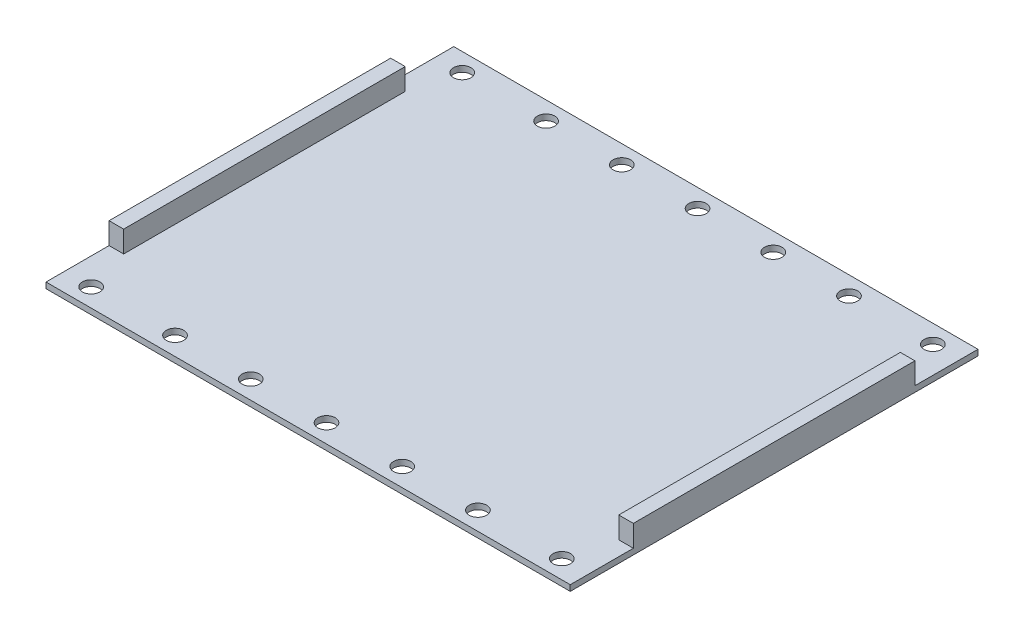
ISO-10303-21;
HEADER;
FILE_DESCRIPTION(('STEP AP214'),'2;1');
FILE_NAME('part.step','',(''),(''),'','','');
FILE_SCHEMA(('AUTOMOTIVE_DESIGN { 1 0 10303 214 1 1 1 1 }'));
ENDSEC;
DATA;
#1=APPLICATION_CONTEXT('core data for automotive mechanical design processes');
#2=APPLICATION_PROTOCOL_DEFINITION('international standard','automotive_design',2000,#1);
#3=PRODUCT_CONTEXT('',#1,'mechanical');
#4=PRODUCT('Part','Part','',(#3));
#5=PRODUCT_RELATED_PRODUCT_CATEGORY('part','',(#4));
#6=PRODUCT_DEFINITION_FORMATION('','',#4);
#7=PRODUCT_DEFINITION_CONTEXT('part definition',#1,'design');
#8=PRODUCT_DEFINITION('design','',#6,#7);
#9=PRODUCT_DEFINITION_SHAPE('','',#8);
#10=(LENGTH_UNIT() NAMED_UNIT(*) SI_UNIT(.MILLI.,.METRE.));
#11=(NAMED_UNIT(*) PLANE_ANGLE_UNIT() SI_UNIT($,.RADIAN.));
#12=(NAMED_UNIT(*) SI_UNIT($,.STERADIAN.) SOLID_ANGLE_UNIT());
#13=UNCERTAINTY_MEASURE_WITH_UNIT(LENGTH_MEASURE(1.E-05),#10,'distance_accuracy_value','');
#14=(GEOMETRIC_REPRESENTATION_CONTEXT(3) GLOBAL_UNCERTAINTY_ASSIGNED_CONTEXT((#13)) GLOBAL_UNIT_ASSIGNED_CONTEXT((#10,
#11,#12)) REPRESENTATION_CONTEXT('',''));
#15=CARTESIAN_POINT('',(0.,0.,0.));
#16=DIRECTION('',(0.,0.,1.));
#17=DIRECTION('',(1.,0.,0.));
#18=AXIS2_PLACEMENT_3D('',#15,#16,#17);
#19=CARTESIAN_POINT('',(0.,1.,0.));
#20=DIRECTION('',(0.,1.,0.));
#21=DIRECTION('',(0.,0.,1.));
#22=AXIS2_PLACEMENT_3D('',#19,#20,#21);
#23=PLANE('',#22);
#24=CARTESIAN_POINT('',(-13.,0.999999999999999,-31.85));
#25=DIRECTION('',(0.,1.,0.));
#26=DIRECTION('',(0.,0.,1.));
#27=AXIS2_PLACEMENT_3D('',#24,#25,#26);
#28=CIRCLE('',#27,1.5);
#29=CARTESIAN_POINT('',(-13.,0.999999999999999,-30.35));
#30=VERTEX_POINT('',#29);
#31=EDGE_CURVE('E414',#30,#30,#28,.F.);
#32=ORIENTED_EDGE('',*,*,#31,.T.);
#33=EDGE_LOOP('',(#32));
#34=FACE_BOUND('',#33,.T.);
#35=CARTESIAN_POINT('',(26.,0.999999999999999,-31.85));
#36=DIRECTION('',(0.,1.,0.));
#37=DIRECTION('',(0.,0.,1.));
#38=AXIS2_PLACEMENT_3D('',#35,#36,#37);
#39=CIRCLE('',#38,1.5);
#40=CARTESIAN_POINT('',(26.,0.999999999999999,-30.35));
#41=VERTEX_POINT('',#40);
#42=EDGE_CURVE('E411',#41,#41,#39,.F.);
#43=ORIENTED_EDGE('',*,*,#42,.T.);
#44=EDGE_LOOP('',(#43));
#45=FACE_BOUND('',#44,.T.);
#46=CARTESIAN_POINT('',(-26.,0.999999999999999,-31.85));
#47=DIRECTION('',(0.,1.,0.));
#48=DIRECTION('',(0.,0.,1.));
#49=AXIS2_PLACEMENT_3D('',#46,#47,#48);
#50=CIRCLE('',#49,1.5);
#51=CARTESIAN_POINT('',(-26.,0.999999999999999,-30.35));
#52=VERTEX_POINT('',#51);
#53=EDGE_CURVE('E391',#52,#52,#50,.F.);
#54=ORIENTED_EDGE('',*,*,#53,.T.);
#55=EDGE_LOOP('',(#54));
#56=FACE_BOUND('',#55,.T.);
#57=CARTESIAN_POINT('',(13.,0.999999999999999,-31.85));
#58=DIRECTION('',(0.,1.,0.));
#59=DIRECTION('',(0.,0.,1.));
#60=AXIS2_PLACEMENT_3D('',#57,#58,#59);
#61=CIRCLE('',#60,1.5);
#62=CARTESIAN_POINT('',(13.,0.999999999999999,-30.35));
#63=VERTEX_POINT('',#62);
#64=EDGE_CURVE('E407',#63,#63,#61,.F.);
#65=ORIENTED_EDGE('',*,*,#64,.T.);
#66=EDGE_LOOP('',(#65));
#67=FACE_BOUND('',#66,.T.);
#68=CARTESIAN_POINT('',(0.,0.999999999999999,-31.85));
#69=DIRECTION('',(0.,1.,0.));
#70=DIRECTION('',(0.,0.,1.));
#71=AXIS2_PLACEMENT_3D('',#68,#69,#70);
#72=CIRCLE('',#71,1.5);
#73=CARTESIAN_POINT('',(0.,0.999999999999999,-30.35));
#74=VERTEX_POINT('',#73);
#75=EDGE_CURVE('E419',#74,#74,#72,.F.);
#76=ORIENTED_EDGE('',*,*,#75,.T.);
#77=EDGE_LOOP('',(#76));
#78=FACE_BOUND('',#77,.T.);
#79=CARTESIAN_POINT('',(-26.,0.999999999999999,31.85));
#80=DIRECTION('',(0.,1.,0.));
#81=DIRECTION('',(0.,0.,1.));
#82=AXIS2_PLACEMENT_3D('',#79,#80,#81);
#83=CIRCLE('',#82,1.5);
#84=CARTESIAN_POINT('',(-26.,0.999999999999999,33.35));
#85=VERTEX_POINT('',#84);
#86=EDGE_CURVE('E429',#85,#85,#83,.T.);
#87=ORIENTED_EDGE('',*,*,#86,.F.);
#88=EDGE_LOOP('',(#87));
#89=FACE_BOUND('',#88,.T.);
#90=CARTESIAN_POINT('',(13.,0.999999999999999,31.85));
#91=DIRECTION('',(0.,1.,0.));
#92=DIRECTION('',(0.,0.,1.));
#93=AXIS2_PLACEMENT_3D('',#90,#91,#92);
#94=CIRCLE('',#93,1.5);
#95=CARTESIAN_POINT('',(13.,0.999999999999999,33.35));
#96=VERTEX_POINT('',#95);
#97=EDGE_CURVE('E428',#96,#96,#94,.T.);
#98=ORIENTED_EDGE('',*,*,#97,.F.);
#99=EDGE_LOOP('',(#98));
#100=FACE_BOUND('',#99,.T.);
#101=CARTESIAN_POINT('',(26.,0.999999999999999,31.85));
#102=DIRECTION('',(0.,1.,0.));
#103=DIRECTION('',(0.,0.,1.));
#104=AXIS2_PLACEMENT_3D('',#101,#102,#103);
#105=CIRCLE('',#104,1.5);
#106=CARTESIAN_POINT('',(26.,0.999999999999999,33.35));
#107=VERTEX_POINT('',#106);
#108=EDGE_CURVE('E422',#107,#107,#105,.T.);
#109=ORIENTED_EDGE('',*,*,#108,.F.);
#110=EDGE_LOOP('',(#109));
#111=FACE_BOUND('',#110,.T.);
#112=CARTESIAN_POINT('',(-13.,0.999999999999999,31.85));
#113=DIRECTION('',(0.,1.,0.));
#114=DIRECTION('',(0.,0.,1.));
#115=AXIS2_PLACEMENT_3D('',#112,#113,#114);
#116=CIRCLE('',#115,1.5);
#117=CARTESIAN_POINT('',(-13.,0.999999999999999,33.35));
#118=VERTEX_POINT('',#117);
#119=EDGE_CURVE('E436',#118,#118,#116,.T.);
#120=ORIENTED_EDGE('',*,*,#119,.F.);
#121=EDGE_LOOP('',(#120));
#122=FACE_BOUND('',#121,.T.);
#123=CARTESIAN_POINT('',(0.,0.999999999999999,31.85));
#124=DIRECTION('',(0.,1.,0.));
#125=DIRECTION('',(0.,0.,1.));
#126=AXIS2_PLACEMENT_3D('',#123,#124,#125);
#127=CIRCLE('',#126,1.5);
#128=CARTESIAN_POINT('',(0.,0.999999999999999,33.35));
#129=VERTEX_POINT('',#128);
#130=EDGE_CURVE('E157',#129,#129,#127,.T.);
#131=ORIENTED_EDGE('',*,*,#130,.F.);
#132=EDGE_LOOP('',(#131));
#133=FACE_BOUND('',#132,.T.);
#134=DIRECTION('',(-1.,0.,0.));
#135=VECTOR('',#134,1.);
#136=CARTESIAN_POINT('',(-42.5,1.,24.1700000000001));
#137=LINE('',#136,#135);
#138=CARTESIAN_POINT('',(-42.5,1.,24.1700000000001));
#139=VERTEX_POINT('',#138);
#140=CARTESIAN_POINT('',(-45.,1.,24.1700000000001));
#141=VERTEX_POINT('',#140);
#142=EDGE_CURVE('E155',#139,#141,#137,.T.);
#143=ORIENTED_EDGE('',*,*,#142,.T.);
#144=DIRECTION('',(0.,0.,1.));
#145=VECTOR('',#144,1.);
#146=CARTESIAN_POINT('',(-45.,1.,-35.));
#147=LINE('',#146,#145);
#148=CARTESIAN_POINT('',(-45.,1.,35.));
#149=VERTEX_POINT('',#148);
#150=EDGE_CURVE('E131',#141,#149,#147,.T.);
#151=ORIENTED_EDGE('',*,*,#150,.T.);
#152=DIRECTION('',(1.,0.,0.));
#153=VECTOR('',#152,1.);
#154=CARTESIAN_POINT('',(-45.,1.,35.));
#155=LINE('',#154,#153);
#156=CARTESIAN_POINT('',(45.,1.,35.));
#157=VERTEX_POINT('',#156);
#158=EDGE_CURVE('E225',#149,#157,#155,.T.);
#159=ORIENTED_EDGE('',*,*,#158,.T.);
#160=DIRECTION('',(0.,0.,-1.));
#161=VECTOR('',#160,1.);
#162=CARTESIAN_POINT('',(45.,1.,-35.));
#163=LINE('',#162,#161);
#164=CARTESIAN_POINT('',(45.,1.,24.1700000000001));
#165=VERTEX_POINT('',#164);
#166=EDGE_CURVE('E218',#157,#165,#163,.T.);
#167=ORIENTED_EDGE('',*,*,#166,.T.);
#168=DIRECTION('',(1.,0.,0.));
#169=VECTOR('',#168,1.);
#170=CARTESIAN_POINT('',(42.5,1.,24.1700000000001));
#171=LINE('',#170,#169);
#172=CARTESIAN_POINT('',(42.5,1.,24.1700000000001));
#173=VERTEX_POINT('',#172);
#174=EDGE_CURVE('E168',#173,#165,#171,.T.);
#175=ORIENTED_EDGE('',*,*,#174,.F.);
#176=DIRECTION('',(0.,0.,1.));
#177=VECTOR('',#176,1.);
#178=CARTESIAN_POINT('',(42.5,1.,24.1700000000001));
#179=LINE('',#178,#177);
#180=CARTESIAN_POINT('',(42.5,1.,-24.1699999999999));
#181=VERTEX_POINT('',#180);
#182=EDGE_CURVE('E177',#181,#173,#179,.T.);
#183=ORIENTED_EDGE('',*,*,#182,.F.);
#184=DIRECTION('',(-1.,0.,0.));
#185=VECTOR('',#184,1.);
#186=CARTESIAN_POINT('',(42.5,1.,-24.1699999999999));
#187=LINE('',#186,#185);
#188=CARTESIAN_POINT('',(45.,1.,-24.1699999999999));
#189=VERTEX_POINT('',#188);
#190=EDGE_CURVE('E135',#189,#181,#187,.T.);
#191=ORIENTED_EDGE('',*,*,#190,.F.);
#192=CARTESIAN_POINT('',(45.,1.,-35.));
#193=VERTEX_POINT('',#192);
#194=EDGE_CURVE('E221',#189,#193,#163,.T.);
#195=ORIENTED_EDGE('',*,*,#194,.T.);
#196=DIRECTION('',(-1.,0.,0.));
#197=VECTOR('',#196,1.);
#198=CARTESIAN_POINT('',(-45.,1.,-35.));
#199=LINE('',#198,#197);
#200=CARTESIAN_POINT('',(-45.,1.,-35.));
#201=VERTEX_POINT('',#200);
#202=EDGE_CURVE('E220',#193,#201,#199,.T.);
#203=ORIENTED_EDGE('',*,*,#202,.T.);
#204=CARTESIAN_POINT('',(-45.,1.,-24.1699999999999));
#205=VERTEX_POINT('',#204);
#206=EDGE_CURVE('E223',#201,#205,#147,.T.);
#207=ORIENTED_EDGE('',*,*,#206,.T.);
#208=DIRECTION('',(1.,0.,0.));
#209=VECTOR('',#208,1.);
#210=CARTESIAN_POINT('',(-42.5,1.,-24.1699999999999));
#211=LINE('',#210,#209);
#212=CARTESIAN_POINT('',(-42.5,1.,-24.1699999999999));
#213=VERTEX_POINT('',#212);
#214=EDGE_CURVE('E55',#205,#213,#211,.T.);
#215=ORIENTED_EDGE('',*,*,#214,.T.);
#216=DIRECTION('',(0.,0.,1.));
#217=VECTOR('',#216,1.);
#218=CARTESIAN_POINT('',(-42.5,1.,24.1700000000001));
#219=LINE('',#218,#217);
#220=EDGE_CURVE('E50',#213,#139,#219,.T.);
#221=ORIENTED_EDGE('',*,*,#220,.T.);
#222=EDGE_LOOP('',(#143,#151,#159,#167,#175,#183,#191,#195,#203,#207,#215,#221));
#223=FACE_BOUND('',#222,.T.);
#224=CARTESIAN_POINT('',(40.4,1.,-31.85));
#225=DIRECTION('',(0.,1.,0.));
#226=DIRECTION('',(0.,0.,-1.));
#227=AXIS2_PLACEMENT_3D('',#224,#225,#226);
#228=CIRCLE('',#227,1.5);
#229=CARTESIAN_POINT('',(40.4,1.,-33.35));
#230=VERTEX_POINT('',#229);
#231=EDGE_CURVE('E200',#230,#230,#228,.T.);
#232=ORIENTED_EDGE('',*,*,#231,.F.);
#233=EDGE_LOOP('',(#232));
#234=FACE_BOUND('',#233,.T.);
#235=CARTESIAN_POINT('',(40.4,1.,31.85));
#236=DIRECTION('',(0.,1.,0.));
#237=DIRECTION('',(0.,0.,1.));
#238=AXIS2_PLACEMENT_3D('',#235,#236,#237);
#239=CIRCLE('',#238,1.5);
#240=CARTESIAN_POINT('',(40.4,1.,33.35));
#241=VERTEX_POINT('',#240);
#242=EDGE_CURVE('E212',#241,#241,#239,.T.);
#243=ORIENTED_EDGE('',*,*,#242,.F.);
#244=EDGE_LOOP('',(#243));
#245=FACE_BOUND('',#244,.T.);
#246=CARTESIAN_POINT('',(-40.4,1.,31.85));
#247=DIRECTION('',(0.,1.,0.));
#248=DIRECTION('',(0.,0.,-1.));
#249=AXIS2_PLACEMENT_3D('',#246,#247,#248);
#250=CIRCLE('',#249,1.5);
#251=CARTESIAN_POINT('',(-40.4,1.,30.35));
#252=VERTEX_POINT('',#251);
#253=EDGE_CURVE('E206',#252,#252,#250,.T.);
#254=ORIENTED_EDGE('',*,*,#253,.F.);
#255=EDGE_LOOP('',(#254));
#256=FACE_BOUND('',#255,.T.);
#257=CARTESIAN_POINT('',(-40.4,1.,-31.85));
#258=DIRECTION('',(0.,1.,0.));
#259=DIRECTION('',(0.,0.,1.));
#260=AXIS2_PLACEMENT_3D('',#257,#258,#259);
#261=CIRCLE('',#260,1.5);
#262=CARTESIAN_POINT('',(-40.4,1.,-30.35));
#263=VERTEX_POINT('',#262);
#264=EDGE_CURVE('E194',#263,#263,#261,.T.);
#265=ORIENTED_EDGE('',*,*,#264,.F.);
#266=EDGE_LOOP('',(#265));
#267=FACE_BOUND('',#266,.T.);
#268=ADVANCED_FACE('F35',(#34,#45,#56,#67,#78,#89,#100,#111,#122,#133,#223,#234,#245,#256,#267),
#23,.T.);
#269=CARTESIAN_POINT('',(0.,0.,0.));
#270=DIRECTION('',(0.,1.,0.));
#271=DIRECTION('',(0.,0.,1.));
#272=AXIS2_PLACEMENT_3D('',#269,#270,#271);
#273=PLANE('',#272);
#274=CARTESIAN_POINT('',(-13.,0.,-31.85));
#275=DIRECTION('',(0.,1.,0.));
#276=DIRECTION('',(0.,0.,1.));
#277=AXIS2_PLACEMENT_3D('',#274,#275,#276);
#278=CIRCLE('',#277,1.5);
#279=CARTESIAN_POINT('',(-13.,0.,-30.35));
#280=VERTEX_POINT('',#279);
#281=EDGE_CURVE('E396',#280,#280,#278,.T.);
#282=ORIENTED_EDGE('',*,*,#281,.T.);
#283=EDGE_LOOP('',(#282));
#284=FACE_BOUND('',#283,.T.);
#285=CARTESIAN_POINT('',(26.,0.,-31.85));
#286=DIRECTION('',(0.,1.,0.));
#287=DIRECTION('',(0.,0.,1.));
#288=AXIS2_PLACEMENT_3D('',#285,#286,#287);
#289=CIRCLE('',#288,1.5);
#290=CARTESIAN_POINT('',(26.,0.,-30.35));
#291=VERTEX_POINT('',#290);
#292=EDGE_CURVE('E399',#291,#291,#289,.T.);
#293=ORIENTED_EDGE('',*,*,#292,.T.);
#294=EDGE_LOOP('',(#293));
#295=FACE_BOUND('',#294,.T.);
#296=CARTESIAN_POINT('',(-26.,0.,-31.85));
#297=DIRECTION('',(0.,1.,0.));
#298=DIRECTION('',(0.,0.,1.));
#299=AXIS2_PLACEMENT_3D('',#296,#297,#298);
#300=CIRCLE('',#299,1.5);
#301=CARTESIAN_POINT('',(-26.,0.,-30.35));
#302=VERTEX_POINT('',#301);
#303=EDGE_CURVE('E394',#302,#302,#300,.T.);
#304=ORIENTED_EDGE('',*,*,#303,.T.);
#305=EDGE_LOOP('',(#304));
#306=FACE_BOUND('',#305,.T.);
#307=CARTESIAN_POINT('',(13.,0.,-31.85));
#308=DIRECTION('',(0.,1.,0.));
#309=DIRECTION('',(0.,0.,1.));
#310=AXIS2_PLACEMENT_3D('',#307,#308,#309);
#311=CIRCLE('',#310,1.5);
#312=CARTESIAN_POINT('',(13.,0.,-30.35));
#313=VERTEX_POINT('',#312);
#314=EDGE_CURVE('E403',#313,#313,#311,.T.);
#315=ORIENTED_EDGE('',*,*,#314,.T.);
#316=EDGE_LOOP('',(#315));
#317=FACE_BOUND('',#316,.T.);
#318=CARTESIAN_POINT('',(0.,0.,-31.85));
#319=DIRECTION('',(0.,1.,0.));
#320=DIRECTION('',(0.,0.,1.));
#321=AXIS2_PLACEMENT_3D('',#318,#319,#320);
#322=CIRCLE('',#321,1.5);
#323=CARTESIAN_POINT('',(0.,0.,-30.35));
#324=VERTEX_POINT('',#323);
#325=EDGE_CURVE('E416',#324,#324,#322,.T.);
#326=ORIENTED_EDGE('',*,*,#325,.T.);
#327=EDGE_LOOP('',(#326));
#328=FACE_BOUND('',#327,.T.);
#329=CARTESIAN_POINT('',(-26.,0.,31.85));
#330=DIRECTION('',(0.,-1.,0.));
#331=DIRECTION('',(0.,0.,-1.));
#332=AXIS2_PLACEMENT_3D('',#329,#330,#331);
#333=CIRCLE('',#332,1.5);
#334=CARTESIAN_POINT('',(-26.,0.,30.35));
#335=VERTEX_POINT('',#334);
#336=EDGE_CURVE('E432',#335,#335,#333,.T.);
#337=ORIENTED_EDGE('',*,*,#336,.F.);
#338=EDGE_LOOP('',(#337));
#339=FACE_BOUND('',#338,.T.);
#340=CARTESIAN_POINT('',(13.,0.,31.85));
#341=DIRECTION('',(0.,-1.,0.));
#342=DIRECTION('',(0.,0.,-1.));
#343=AXIS2_PLACEMENT_3D('',#340,#341,#342);
#344=CIRCLE('',#343,1.5);
#345=CARTESIAN_POINT('',(13.,0.,30.35));
#346=VERTEX_POINT('',#345);
#347=EDGE_CURVE('E433',#346,#346,#344,.T.);
#348=ORIENTED_EDGE('',*,*,#347,.F.);
#349=EDGE_LOOP('',(#348));
#350=FACE_BOUND('',#349,.T.);
#351=CARTESIAN_POINT('',(26.,0.,31.85));
#352=DIRECTION('',(0.,-1.,0.));
#353=DIRECTION('',(0.,0.,-1.));
#354=AXIS2_PLACEMENT_3D('',#351,#352,#353);
#355=CIRCLE('',#354,1.5);
#356=CARTESIAN_POINT('',(26.,0.,30.35));
#357=VERTEX_POINT('',#356);
#358=EDGE_CURVE('E425',#357,#357,#355,.T.);
#359=ORIENTED_EDGE('',*,*,#358,.F.);
#360=EDGE_LOOP('',(#359));
#361=FACE_BOUND('',#360,.T.);
#362=CARTESIAN_POINT('',(-13.,0.,31.85));
#363=DIRECTION('',(0.,-1.,0.));
#364=DIRECTION('',(0.,0.,-1.));
#365=AXIS2_PLACEMENT_3D('',#362,#363,#364);
#366=CIRCLE('',#365,1.5);
#367=CARTESIAN_POINT('',(-13.,0.,30.35));
#368=VERTEX_POINT('',#367);
#369=EDGE_CURVE('E443',#368,#368,#366,.T.);
#370=ORIENTED_EDGE('',*,*,#369,.F.);
#371=EDGE_LOOP('',(#370));
#372=FACE_BOUND('',#371,.T.);
#373=CARTESIAN_POINT('',(0.,0.,31.85));
#374=DIRECTION('',(0.,-1.,0.));
#375=DIRECTION('',(0.,0.,-1.));
#376=AXIS2_PLACEMENT_3D('',#373,#374,#375);
#377=CIRCLE('',#376,1.5);
#378=CARTESIAN_POINT('',(0.,0.,30.35));
#379=VERTEX_POINT('',#378);
#380=EDGE_CURVE('E446',#379,#379,#377,.T.);
#381=ORIENTED_EDGE('',*,*,#380,.F.);
#382=EDGE_LOOP('',(#381));
#383=FACE_BOUND('',#382,.T.);
#384=DIRECTION('',(0.,0.,-1.));
#385=VECTOR('',#384,1.);
#386=CARTESIAN_POINT('',(45.,0.,-35.));
#387=LINE('',#386,#385);
#388=CARTESIAN_POINT('',(45.,0.,35.));
#389=VERTEX_POINT('',#388);
#390=CARTESIAN_POINT('',(45.,0.,-35.));
#391=VERTEX_POINT('',#390);
#392=EDGE_CURVE('E215',#389,#391,#387,.T.);
#393=ORIENTED_EDGE('',*,*,#392,.F.);
#394=DIRECTION('',(1.,0.,0.));
#395=VECTOR('',#394,1.);
#396=CARTESIAN_POINT('',(-45.,0.,35.));
#397=LINE('',#396,#395);
#398=CARTESIAN_POINT('',(-45.,0.,35.));
#399=VERTEX_POINT('',#398);
#400=EDGE_CURVE('E234',#399,#389,#397,.T.);
#401=ORIENTED_EDGE('',*,*,#400,.F.);
#402=DIRECTION('',(0.,0.,1.));
#403=VECTOR('',#402,1.);
#404=CARTESIAN_POINT('',(-45.,0.,-35.));
#405=LINE('',#404,#403);
#406=CARTESIAN_POINT('',(-45.,0.,-35.));
#407=VERTEX_POINT('',#406);
#408=EDGE_CURVE('E232',#407,#399,#405,.T.);
#409=ORIENTED_EDGE('',*,*,#408,.F.);
#410=DIRECTION('',(-1.,0.,0.));
#411=VECTOR('',#410,1.);
#412=CARTESIAN_POINT('',(-45.,0.,-35.));
#413=LINE('',#412,#411);
#414=EDGE_CURVE('E230',#391,#407,#413,.T.);
#415=ORIENTED_EDGE('',*,*,#414,.F.);
#416=EDGE_LOOP('',(#393,#401,#409,#415));
#417=FACE_BOUND('',#416,.T.);
#418=CARTESIAN_POINT('',(40.4,0.,31.85));
#419=DIRECTION('',(0.,1.,0.));
#420=DIRECTION('',(0.,0.,1.));
#421=AXIS2_PLACEMENT_3D('',#418,#419,#420);
#422=CIRCLE('',#421,1.5);
#423=CARTESIAN_POINT('',(40.4,0.,33.35));
#424=VERTEX_POINT('',#423);
#425=EDGE_CURVE('E209',#424,#424,#422,.T.);
#426=ORIENTED_EDGE('',*,*,#425,.T.);
#427=EDGE_LOOP('',(#426));
#428=FACE_BOUND('',#427,.T.);
#429=CARTESIAN_POINT('',(-40.4,0.,31.85));
#430=DIRECTION('',(0.,1.,0.));
#431=DIRECTION('',(0.,0.,-1.));
#432=AXIS2_PLACEMENT_3D('',#429,#430,#431);
#433=CIRCLE('',#432,1.5);
#434=CARTESIAN_POINT('',(-40.4,0.,30.35));
#435=VERTEX_POINT('',#434);
#436=EDGE_CURVE('E203',#435,#435,#433,.T.);
#437=ORIENTED_EDGE('',*,*,#436,.T.);
#438=EDGE_LOOP('',(#437));
#439=FACE_BOUND('',#438,.T.);
#440=CARTESIAN_POINT('',(40.4,0.,-31.85));
#441=DIRECTION('',(0.,1.,0.));
#442=DIRECTION('',(0.,0.,-1.));
#443=AXIS2_PLACEMENT_3D('',#440,#441,#442);
#444=CIRCLE('',#443,1.5);
#445=CARTESIAN_POINT('',(40.4,0.,-33.35));
#446=VERTEX_POINT('',#445);
#447=EDGE_CURVE('E197',#446,#446,#444,.T.);
#448=ORIENTED_EDGE('',*,*,#447,.T.);
#449=EDGE_LOOP('',(#448));
#450=FACE_BOUND('',#449,.T.);
#451=CARTESIAN_POINT('',(-40.4,0.,-31.85));
#452=DIRECTION('',(0.,1.,0.));
#453=DIRECTION('',(0.,0.,1.));
#454=AXIS2_PLACEMENT_3D('',#451,#452,#453);
#455=CIRCLE('',#454,1.5);
#456=CARTESIAN_POINT('',(-40.4,0.,-30.35));
#457=VERTEX_POINT('',#456);
#458=EDGE_CURVE('E193',#457,#457,#455,.T.);
#459=ORIENTED_EDGE('',*,*,#458,.T.);
#460=EDGE_LOOP('',(#459));
#461=FACE_BOUND('',#460,.T.);
#462=ADVANCED_FACE('F249',(#284,#295,#306,#317,#328,#339,#350,#361,#372,#383,#417,#428,#439,
#450,#461),#273,.F.);
#463=CARTESIAN_POINT('',(45.,1.,-35.));
#464=DIRECTION('',(-1.,0.,0.));
#465=DIRECTION('',(0.,0.,1.));
#466=AXIS2_PLACEMENT_3D('',#463,#464,#465);
#467=PLANE('',#466);
#468=ORIENTED_EDGE('',*,*,#392,.T.);
#469=DIRECTION('',(0.,-1.,0.));
#470=VECTOR('',#469,1.);
#471=CARTESIAN_POINT('',(45.,1.,-35.));
#472=LINE('',#471,#470);
#473=EDGE_CURVE('E11',#193,#391,#472,.T.);
#474=ORIENTED_EDGE('',*,*,#473,.F.);
#475=ORIENTED_EDGE('',*,*,#194,.F.);
#476=DIRECTION('',(0.,-1.,0.));
#477=VECTOR('',#476,1.);
#478=CARTESIAN_POINT('',(45.,4.7,-24.1699999999999));
#479=LINE('',#478,#477);
#480=CARTESIAN_POINT('',(45.,4.7,-24.1699999999999));
#481=VERTEX_POINT('',#480);
#482=EDGE_CURVE('E190',#481,#189,#479,.T.);
#483=ORIENTED_EDGE('',*,*,#482,.F.);
#484=DIRECTION('',(0.,0.,-1.));
#485=VECTOR('',#484,1.);
#486=CARTESIAN_POINT('',(45.,4.7,24.1700000000001));
#487=LINE('',#486,#485);
#488=CARTESIAN_POINT('',(45.,4.7,24.1700000000001));
#489=VERTEX_POINT('',#488);
#490=EDGE_CURVE('E164',#489,#481,#487,.T.);
#491=ORIENTED_EDGE('',*,*,#490,.F.);
#492=DIRECTION('',(0.,-1.,0.));
#493=VECTOR('',#492,1.);
#494=CARTESIAN_POINT('',(45.,4.7,24.1700000000001));
#495=LINE('',#494,#493);
#496=EDGE_CURVE('E174',#489,#165,#495,.T.);
#497=ORIENTED_EDGE('',*,*,#496,.T.);
#498=ORIENTED_EDGE('',*,*,#166,.F.);
#499=DIRECTION('',(0.,-1.,0.));
#500=VECTOR('',#499,1.);
#501=CARTESIAN_POINT('',(45.,1.,35.));
#502=LINE('',#501,#500);
#503=EDGE_CURVE('E227',#157,#389,#502,.T.);
#504=ORIENTED_EDGE('',*,*,#503,.T.);
#505=EDGE_LOOP('',(#468,#474,#475,#483,#491,#497,#498,#504));
#506=FACE_BOUND('',#505,.T.);
#507=ADVANCED_FACE('F37',(#506),#467,.F.);
#508=CARTESIAN_POINT('',(-45.,1.,-35.));
#509=DIRECTION('',(0.,0.,1.));
#510=DIRECTION('',(1.,0.,0.));
#511=AXIS2_PLACEMENT_3D('',#508,#509,#510);
#512=PLANE('',#511);
#513=ORIENTED_EDGE('',*,*,#414,.T.);
#514=DIRECTION('',(0.,-1.,0.));
#515=VECTOR('',#514,1.);
#516=CARTESIAN_POINT('',(-45.,1.,-35.));
#517=LINE('',#516,#515);
#518=EDGE_CURVE('E43',#201,#407,#517,.T.);
#519=ORIENTED_EDGE('',*,*,#518,.F.);
#520=ORIENTED_EDGE('',*,*,#202,.F.);
#521=ORIENTED_EDGE('',*,*,#473,.T.);
#522=EDGE_LOOP('',(#513,#519,#520,#521));
#523=FACE_BOUND('',#522,.T.);
#524=ADVANCED_FACE('F273',(#523),#512,.F.);
#525=CARTESIAN_POINT('',(-45.,1.,-35.));
#526=DIRECTION('',(1.,0.,0.));
#527=DIRECTION('',(0.,0.,-1.));
#528=AXIS2_PLACEMENT_3D('',#525,#526,#527);
#529=PLANE('',#528);
#530=ORIENTED_EDGE('',*,*,#408,.T.);
#531=DIRECTION('',(0.,-1.,0.));
#532=VECTOR('',#531,1.);
#533=CARTESIAN_POINT('',(-45.,1.,35.));
#534=LINE('',#533,#532);
#535=EDGE_CURVE('E238',#149,#399,#534,.T.);
#536=ORIENTED_EDGE('',*,*,#535,.F.);
#537=ORIENTED_EDGE('',*,*,#150,.F.);
#538=DIRECTION('',(0.,-1.,0.));
#539=VECTOR('',#538,1.);
#540=CARTESIAN_POINT('',(-45.,4.7,24.1700000000001));
#541=LINE('',#540,#539);
#542=CARTESIAN_POINT('',(-45.,4.7,24.1700000000001));
#543=VERTEX_POINT('',#542);
#544=EDGE_CURVE('E124',#543,#141,#541,.T.);
#545=ORIENTED_EDGE('',*,*,#544,.F.);
#546=DIRECTION('',(0.,0.,-1.));
#547=VECTOR('',#546,1.);
#548=CARTESIAN_POINT('',(-45.,4.7,24.1700000000001));
#549=LINE('',#548,#547);
#550=CARTESIAN_POINT('',(-45.,4.7,-24.1699999999999));
#551=VERTEX_POINT('',#550);
#552=EDGE_CURVE('E128',#543,#551,#549,.T.);
#553=ORIENTED_EDGE('',*,*,#552,.T.);
#554=DIRECTION('',(0.,-1.,0.));
#555=VECTOR('',#554,1.);
#556=CARTESIAN_POINT('',(-45.,4.7,-24.1699999999999));
#557=LINE('',#556,#555);
#558=EDGE_CURVE('E154',#551,#205,#557,.T.);
#559=ORIENTED_EDGE('',*,*,#558,.T.);
#560=ORIENTED_EDGE('',*,*,#206,.F.);
#561=ORIENTED_EDGE('',*,*,#518,.T.);
#562=EDGE_LOOP('',(#530,#536,#537,#545,#553,#559,#560,#561));
#563=FACE_BOUND('',#562,.T.);
#564=ADVANCED_FACE('F126',(#563),#529,.F.);
#565=CARTESIAN_POINT('',(-45.,1.,35.));
#566=DIRECTION('',(0.,0.,-1.));
#567=DIRECTION('',(-1.,0.,0.));
#568=AXIS2_PLACEMENT_3D('',#565,#566,#567);
#569=PLANE('',#568);
#570=ORIENTED_EDGE('',*,*,#400,.T.);
#571=ORIENTED_EDGE('',*,*,#503,.F.);
#572=ORIENTED_EDGE('',*,*,#158,.F.);
#573=ORIENTED_EDGE('',*,*,#535,.T.);
#574=EDGE_LOOP('',(#570,#571,#572,#573));
#575=FACE_BOUND('',#574,.T.);
#576=ADVANCED_FACE('F253',(#575),#569,.F.);
#577=CARTESIAN_POINT('',(40.4,1.,31.85));
#578=DIRECTION('',(0.,-1.,0.));
#579=DIRECTION('',(0.,0.,-1.));
#580=AXIS2_PLACEMENT_3D('',#577,#578,#579);
#581=CYLINDRICAL_SURFACE('',#580,1.5);
#582=ORIENTED_EDGE('',*,*,#242,.T.);
#583=EDGE_LOOP('',(#582));
#584=FACE_BOUND('',#583,.T.);
#585=ORIENTED_EDGE('',*,*,#425,.F.);
#586=EDGE_LOOP('',(#585));
#587=FACE_BOUND('',#586,.T.);
#588=ADVANCED_FACE('F291',(#584,#587),#581,.F.);
#589=CARTESIAN_POINT('',(-40.4,1.,31.85));
#590=DIRECTION('',(0.,-1.,0.));
#591=DIRECTION('',(0.,0.,-1.));
#592=AXIS2_PLACEMENT_3D('',#589,#590,#591);
#593=CYLINDRICAL_SURFACE('',#592,1.5);
#594=ORIENTED_EDGE('',*,*,#253,.T.);
#595=EDGE_LOOP('',(#594));
#596=FACE_BOUND('',#595,.T.);
#597=ORIENTED_EDGE('',*,*,#436,.F.);
#598=EDGE_LOOP('',(#597));
#599=FACE_BOUND('',#598,.T.);
#600=ADVANCED_FACE('F298',(#596,#599),#593,.F.);
#601=CARTESIAN_POINT('',(40.4,1.,-31.85));
#602=DIRECTION('',(0.,-1.,0.));
#603=DIRECTION('',(0.,0.,-1.));
#604=AXIS2_PLACEMENT_3D('',#601,#602,#603);
#605=CYLINDRICAL_SURFACE('',#604,1.5);
#606=ORIENTED_EDGE('',*,*,#231,.T.);
#607=EDGE_LOOP('',(#606));
#608=FACE_BOUND('',#607,.T.);
#609=ORIENTED_EDGE('',*,*,#447,.F.);
#610=EDGE_LOOP('',(#609));
#611=FACE_BOUND('',#610,.T.);
#612=ADVANCED_FACE('F303',(#608,#611),#605,.F.);
#613=CARTESIAN_POINT('',(-40.4,1.,-31.85));
#614=DIRECTION('',(0.,-1.,0.));
#615=DIRECTION('',(0.,0.,-1.));
#616=AXIS2_PLACEMENT_3D('',#613,#614,#615);
#617=CYLINDRICAL_SURFACE('',#616,1.5);
#618=ORIENTED_EDGE('',*,*,#264,.T.);
#619=EDGE_LOOP('',(#618));
#620=FACE_BOUND('',#619,.T.);
#621=ORIENTED_EDGE('',*,*,#458,.F.);
#622=EDGE_LOOP('',(#621));
#623=FACE_BOUND('',#622,.T.);
#624=ADVANCED_FACE('F315',(#620,#623),#617,.F.);
#625=CARTESIAN_POINT('',(42.5,4.7,-24.1699999999999));
#626=DIRECTION('',(0.,0.,1.));
#627=DIRECTION('',(1.,0.,0.));
#628=AXIS2_PLACEMENT_3D('',#625,#626,#627);
#629=PLANE('',#628);
#630=ORIENTED_EDGE('',*,*,#190,.T.);
#631=DIRECTION('',(0.,-1.,0.));
#632=VECTOR('',#631,1.);
#633=CARTESIAN_POINT('',(42.5,4.7,-24.1699999999999));
#634=LINE('',#633,#632);
#635=CARTESIAN_POINT('',(42.5,4.7,-24.1699999999999));
#636=VERTEX_POINT('',#635);
#637=EDGE_CURVE('E187',#636,#181,#634,.T.);
#638=ORIENTED_EDGE('',*,*,#637,.F.);
#639=DIRECTION('',(-1.,0.,0.));
#640=VECTOR('',#639,1.);
#641=CARTESIAN_POINT('',(42.5,4.7,-24.1699999999999));
#642=LINE('',#641,#640);
#643=EDGE_CURVE('E167',#481,#636,#642,.T.);
#644=ORIENTED_EDGE('',*,*,#643,.F.);
#645=ORIENTED_EDGE('',*,*,#482,.T.);
#646=EDGE_LOOP('',(#630,#638,#644,#645));
#647=FACE_BOUND('',#646,.T.);
#648=ADVANCED_FACE('F271',(#647),#629,.F.);
#649=CARTESIAN_POINT('',(42.5,4.7,24.1700000000001));
#650=DIRECTION('',(1.,0.,0.));
#651=DIRECTION('',(0.,0.,-1.));
#652=AXIS2_PLACEMENT_3D('',#649,#650,#651);
#653=PLANE('',#652);
#654=ORIENTED_EDGE('',*,*,#182,.T.);
#655=DIRECTION('',(0.,-1.,0.));
#656=VECTOR('',#655,1.);
#657=CARTESIAN_POINT('',(42.5,4.7,24.1700000000001));
#658=LINE('',#657,#656);
#659=CARTESIAN_POINT('',(42.5,4.7,24.1700000000001));
#660=VERTEX_POINT('',#659);
#661=EDGE_CURVE('E184',#660,#173,#658,.T.);
#662=ORIENTED_EDGE('',*,*,#661,.F.);
#663=DIRECTION('',(0.,0.,1.));
#664=VECTOR('',#663,1.);
#665=CARTESIAN_POINT('',(42.5,4.7,24.1700000000001));
#666=LINE('',#665,#664);
#667=EDGE_CURVE('E170',#636,#660,#666,.T.);
#668=ORIENTED_EDGE('',*,*,#667,.F.);
#669=ORIENTED_EDGE('',*,*,#637,.T.);
#670=EDGE_LOOP('',(#654,#662,#668,#669));
#671=FACE_BOUND('',#670,.T.);
#672=ADVANCED_FACE('F267',(#671),#653,.F.);
#673=CARTESIAN_POINT('',(42.5,4.7,24.1700000000001));
#674=DIRECTION('',(0.,0.,-1.));
#675=DIRECTION('',(-1.,0.,0.));
#676=AXIS2_PLACEMENT_3D('',#673,#674,#675);
#677=PLANE('',#676);
#678=ORIENTED_EDGE('',*,*,#174,.T.);
#679=ORIENTED_EDGE('',*,*,#496,.F.);
#680=DIRECTION('',(1.,0.,0.));
#681=VECTOR('',#680,1.);
#682=CARTESIAN_POINT('',(42.5,4.7,24.1700000000001));
#683=LINE('',#682,#681);
#684=EDGE_CURVE('E172',#660,#489,#683,.T.);
#685=ORIENTED_EDGE('',*,*,#684,.F.);
#686=ORIENTED_EDGE('',*,*,#661,.T.);
#687=EDGE_LOOP('',(#678,#679,#685,#686));
#688=FACE_BOUND('',#687,.T.);
#689=ADVANCED_FACE('F262',(#688),#677,.F.);
#690=CARTESIAN_POINT('',(0.,4.7,0.));
#691=DIRECTION('',(0.,-1.,0.));
#692=DIRECTION('',(0.,0.,-1.));
#693=AXIS2_PLACEMENT_3D('',#690,#691,#692);
#694=PLANE('',#693);
#695=ORIENTED_EDGE('',*,*,#490,.T.);
#696=ORIENTED_EDGE('',*,*,#643,.T.);
#697=ORIENTED_EDGE('',*,*,#667,.T.);
#698=ORIENTED_EDGE('',*,*,#684,.T.);
#699=EDGE_LOOP('',(#695,#696,#697,#698));
#700=FACE_BOUND('',#699,.T.);
#701=ADVANCED_FACE('F331',(#700),#694,.F.);
#702=CARTESIAN_POINT('',(-42.5,4.7,24.1700000000001));
#703=DIRECTION('',(0.,0.,1.));
#704=DIRECTION('',(1.,0.,0.));
#705=AXIS2_PLACEMENT_3D('',#702,#703,#704);
#706=PLANE('',#705);
#707=ORIENTED_EDGE('',*,*,#142,.F.);
#708=DIRECTION('',(0.,-1.,0.));
#709=VECTOR('',#708,1.);
#710=CARTESIAN_POINT('',(-42.5,4.7,24.1700000000001));
#711=LINE('',#710,#709);
#712=CARTESIAN_POINT('',(-42.5,4.7,24.1700000000001));
#713=VERTEX_POINT('',#712);
#714=EDGE_CURVE('E136',#713,#139,#711,.T.);
#715=ORIENTED_EDGE('',*,*,#714,.F.);
#716=DIRECTION('',(-1.,0.,0.));
#717=VECTOR('',#716,1.);
#718=CARTESIAN_POINT('',(-42.5,4.7,24.1700000000001));
#719=LINE('',#718,#717);
#720=EDGE_CURVE('E142',#713,#543,#719,.T.);
#721=ORIENTED_EDGE('',*,*,#720,.T.);
#722=ORIENTED_EDGE('',*,*,#544,.T.);
#723=EDGE_LOOP('',(#707,#715,#721,#722));
#724=FACE_BOUND('',#723,.T.);
#725=ADVANCED_FACE('F147',(#724),#706,.T.);
#726=CARTESIAN_POINT('',(-42.5,4.7,24.1700000000001));
#727=DIRECTION('',(1.,0.,0.));
#728=DIRECTION('',(0.,0.,-1.));
#729=AXIS2_PLACEMENT_3D('',#726,#727,#728);
#730=PLANE('',#729);
#731=ORIENTED_EDGE('',*,*,#220,.F.);
#732=DIRECTION('',(0.,-1.,0.));
#733=VECTOR('',#732,1.);
#734=CARTESIAN_POINT('',(-42.5,4.7,-24.1699999999999));
#735=LINE('',#734,#733);
#736=CARTESIAN_POINT('',(-42.5,4.7,-24.1699999999999));
#737=VERTEX_POINT('',#736);
#738=EDGE_CURVE('E161',#737,#213,#735,.T.);
#739=ORIENTED_EDGE('',*,*,#738,.F.);
#740=DIRECTION('',(0.,0.,1.));
#741=VECTOR('',#740,1.);
#742=CARTESIAN_POINT('',(-42.5,4.7,24.1700000000001));
#743=LINE('',#742,#741);
#744=EDGE_CURVE('E148',#737,#713,#743,.T.);
#745=ORIENTED_EDGE('',*,*,#744,.T.);
#746=ORIENTED_EDGE('',*,*,#714,.T.);
#747=EDGE_LOOP('',(#731,#739,#745,#746));
#748=FACE_BOUND('',#747,.T.);
#749=ADVANCED_FACE('F337',(#748),#730,.T.);
#750=CARTESIAN_POINT('',(-42.5,4.7,-24.1699999999999));
#751=DIRECTION('',(0.,0.,-1.));
#752=DIRECTION('',(-1.,0.,0.));
#753=AXIS2_PLACEMENT_3D('',#750,#751,#752);
#754=PLANE('',#753);
#755=ORIENTED_EDGE('',*,*,#214,.F.);
#756=ORIENTED_EDGE('',*,*,#558,.F.);
#757=DIRECTION('',(1.,0.,0.));
#758=VECTOR('',#757,1.);
#759=CARTESIAN_POINT('',(-42.5,4.7,-24.1699999999999));
#760=LINE('',#759,#758);
#761=EDGE_CURVE('E145',#551,#737,#760,.T.);
#762=ORIENTED_EDGE('',*,*,#761,.T.);
#763=ORIENTED_EDGE('',*,*,#738,.T.);
#764=EDGE_LOOP('',(#755,#756,#762,#763));
#765=FACE_BOUND('',#764,.T.);
#766=ADVANCED_FACE('F340',(#765),#754,.T.);
#767=CARTESIAN_POINT('',(0.,4.7,0.));
#768=DIRECTION('',(0.,-1.,0.));
#769=DIRECTION('',(0.,0.,-1.));
#770=AXIS2_PLACEMENT_3D('',#767,#768,#769);
#771=PLANE('',#770);
#772=ORIENTED_EDGE('',*,*,#552,.F.);
#773=ORIENTED_EDGE('',*,*,#720,.F.);
#774=ORIENTED_EDGE('',*,*,#744,.F.);
#775=ORIENTED_EDGE('',*,*,#761,.F.);
#776=EDGE_LOOP('',(#772,#773,#774,#775));
#777=FACE_BOUND('',#776,.T.);
#778=ADVANCED_FACE('F140',(#777),#771,.F.);
#779=CARTESIAN_POINT('',(0.,10.,31.85));
#780=DIRECTION('',(0.,-1.,0.));
#781=DIRECTION('',(0.,0.,-1.));
#782=AXIS2_PLACEMENT_3D('',#779,#780,#781);
#783=CYLINDRICAL_SURFACE('',#782,1.5);
#784=ORIENTED_EDGE('',*,*,#130,.T.);
#785=EDGE_LOOP('',(#784));
#786=FACE_BOUND('',#785,.T.);
#787=ORIENTED_EDGE('',*,*,#380,.T.);
#788=EDGE_LOOP('',(#787));
#789=FACE_BOUND('',#788,.T.);
#790=ADVANCED_FACE('F347',(#786,#789),#783,.F.);
#791=CARTESIAN_POINT('',(-13.,10.,31.85));
#792=DIRECTION('',(0.,-1.,0.));
#793=DIRECTION('',(0.,0.,-1.));
#794=AXIS2_PLACEMENT_3D('',#791,#792,#793);
#795=CYLINDRICAL_SURFACE('',#794,1.5);
#796=ORIENTED_EDGE('',*,*,#119,.T.);
#797=EDGE_LOOP('',(#796));
#798=FACE_BOUND('',#797,.T.);
#799=ORIENTED_EDGE('',*,*,#369,.T.);
#800=EDGE_LOOP('',(#799));
#801=FACE_BOUND('',#800,.T.);
#802=ADVANCED_FACE('F350',(#798,#801),#795,.F.);
#803=CARTESIAN_POINT('',(26.,10.,31.85));
#804=DIRECTION('',(0.,-1.,0.));
#805=DIRECTION('',(0.,0.,-1.));
#806=AXIS2_PLACEMENT_3D('',#803,#804,#805);
#807=CYLINDRICAL_SURFACE('',#806,1.5);
#808=ORIENTED_EDGE('',*,*,#108,.T.);
#809=EDGE_LOOP('',(#808));
#810=FACE_BOUND('',#809,.T.);
#811=ORIENTED_EDGE('',*,*,#358,.T.);
#812=EDGE_LOOP('',(#811));
#813=FACE_BOUND('',#812,.T.);
#814=ADVANCED_FACE('F354',(#810,#813),#807,.F.);
#815=CARTESIAN_POINT('',(13.,10.,31.85));
#816=DIRECTION('',(0.,-1.,0.));
#817=DIRECTION('',(0.,0.,-1.));
#818=AXIS2_PLACEMENT_3D('',#815,#816,#817);
#819=CYLINDRICAL_SURFACE('',#818,1.5);
#820=ORIENTED_EDGE('',*,*,#97,.T.);
#821=EDGE_LOOP('',(#820));
#822=FACE_BOUND('',#821,.T.);
#823=ORIENTED_EDGE('',*,*,#347,.T.);
#824=EDGE_LOOP('',(#823));
#825=FACE_BOUND('',#824,.T.);
#826=ADVANCED_FACE('F356',(#822,#825),#819,.F.);
#827=CARTESIAN_POINT('',(-26.,10.,31.85));
#828=DIRECTION('',(0.,-1.,0.));
#829=DIRECTION('',(0.,0.,-1.));
#830=AXIS2_PLACEMENT_3D('',#827,#828,#829);
#831=CYLINDRICAL_SURFACE('',#830,1.5);
#832=ORIENTED_EDGE('',*,*,#86,.T.);
#833=EDGE_LOOP('',(#832));
#834=FACE_BOUND('',#833,.T.);
#835=ORIENTED_EDGE('',*,*,#336,.T.);
#836=EDGE_LOOP('',(#835));
#837=FACE_BOUND('',#836,.T.);
#838=ADVANCED_FACE('F359',(#834,#837),#831,.F.);
#839=CARTESIAN_POINT('',(0.,10.,-31.85));
#840=DIRECTION('',(0.,-1.,0.));
#841=DIRECTION('',(0.,0.,-1.));
#842=AXIS2_PLACEMENT_3D('',#839,#840,#841);
#843=CYLINDRICAL_SURFACE('',#842,1.5);
#844=ORIENTED_EDGE('',*,*,#75,.F.);
#845=EDGE_LOOP('',(#844));
#846=FACE_BOUND('',#845,.T.);
#847=ORIENTED_EDGE('',*,*,#325,.F.);
#848=EDGE_LOOP('',(#847));
#849=FACE_BOUND('',#848,.T.);
#850=ADVANCED_FACE('F363',(#846,#849),#843,.F.);
#851=CARTESIAN_POINT('',(13.,10.,-31.85));
#852=DIRECTION('',(0.,-1.,0.));
#853=DIRECTION('',(0.,0.,-1.));
#854=AXIS2_PLACEMENT_3D('',#851,#852,#853);
#855=CYLINDRICAL_SURFACE('',#854,1.5);
#856=ORIENTED_EDGE('',*,*,#64,.F.);
#857=EDGE_LOOP('',(#856));
#858=FACE_BOUND('',#857,.T.);
#859=ORIENTED_EDGE('',*,*,#314,.F.);
#860=EDGE_LOOP('',(#859));
#861=FACE_BOUND('',#860,.T.);
#862=ADVANCED_FACE('F370',(#858,#861),#855,.F.);
#863=CARTESIAN_POINT('',(-26.,10.,-31.85));
#864=DIRECTION('',(0.,-1.,0.));
#865=DIRECTION('',(0.,0.,-1.));
#866=AXIS2_PLACEMENT_3D('',#863,#864,#865);
#867=CYLINDRICAL_SURFACE('',#866,1.5);
#868=ORIENTED_EDGE('',*,*,#53,.F.);
#869=EDGE_LOOP('',(#868));
#870=FACE_BOUND('',#869,.T.);
#871=ORIENTED_EDGE('',*,*,#303,.F.);
#872=EDGE_LOOP('',(#871));
#873=FACE_BOUND('',#872,.T.);
#874=ADVANCED_FACE('F374',(#870,#873),#867,.F.);
#875=CARTESIAN_POINT('',(26.,10.,-31.85));
#876=DIRECTION('',(0.,-1.,0.));
#877=DIRECTION('',(0.,0.,-1.));
#878=AXIS2_PLACEMENT_3D('',#875,#876,#877);
#879=CYLINDRICAL_SURFACE('',#878,1.5);
#880=ORIENTED_EDGE('',*,*,#42,.F.);
#881=EDGE_LOOP('',(#880));
#882=FACE_BOUND('',#881,.T.);
#883=ORIENTED_EDGE('',*,*,#292,.F.);
#884=EDGE_LOOP('',(#883));
#885=FACE_BOUND('',#884,.T.);
#886=ADVANCED_FACE('F379',(#882,#885),#879,.F.);
#887=CARTESIAN_POINT('',(-13.,10.,-31.85));
#888=DIRECTION('',(0.,-1.,0.));
#889=DIRECTION('',(0.,0.,-1.));
#890=AXIS2_PLACEMENT_3D('',#887,#888,#889);
#891=CYLINDRICAL_SURFACE('',#890,1.5);
#892=ORIENTED_EDGE('',*,*,#31,.F.);
#893=EDGE_LOOP('',(#892));
#894=FACE_BOUND('',#893,.T.);
#895=ORIENTED_EDGE('',*,*,#281,.F.);
#896=EDGE_LOOP('',(#895));
#897=FACE_BOUND('',#896,.T.);
#898=ADVANCED_FACE('F376',(#894,#897),#891,.F.);
#899=CLOSED_SHELL('',(#268,#462,#507,#524,#564,#576,#588,#600,#612,#624,#648,#672,#689,#701,
#725,#749,#766,#778,#790,#802,#814,#826,#838,#850,#862,#874,#886,#898));
#900=MANIFOLD_SOLID_BREP('B2',#899);
#901=ADVANCED_BREP_SHAPE_REPRESENTATION('',(#18,#900),#14);
#902=SHAPE_DEFINITION_REPRESENTATION(#9,#901);
ENDSEC;
END-ISO-10303-21;
